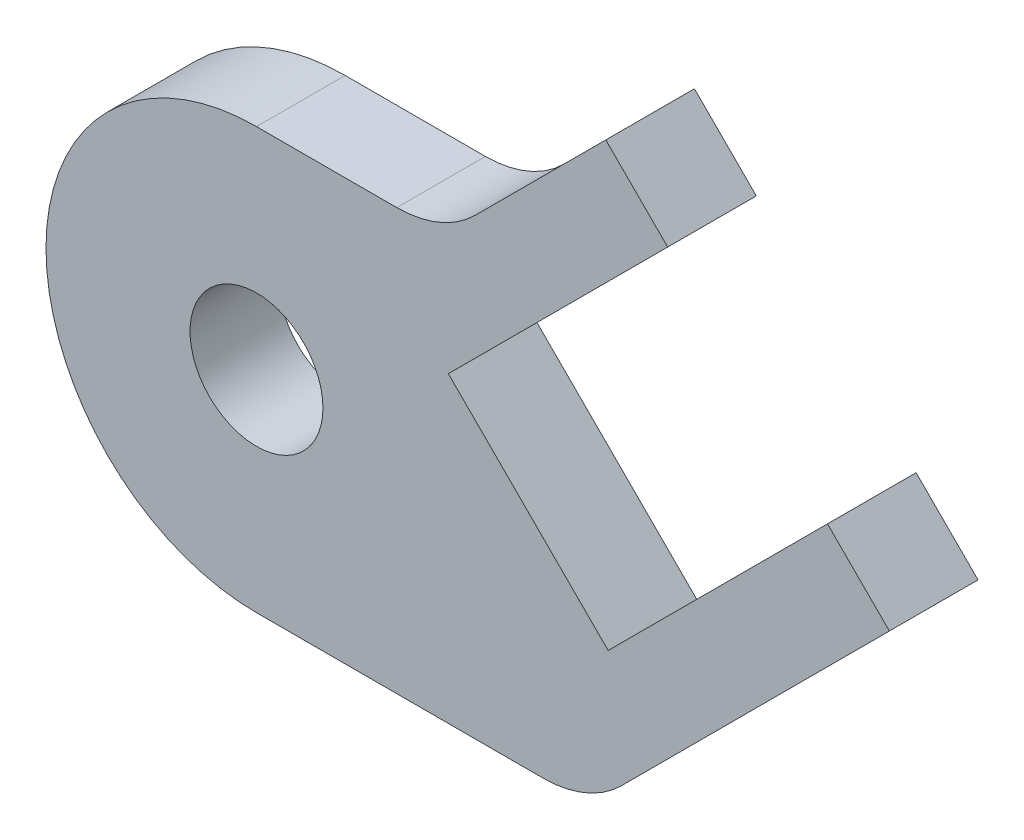
ISO-10303-21;
HEADER;
FILE_DESCRIPTION(('STEP AP214'),'2;1');
FILE_NAME('part.step','',(''),(''),'','','');
FILE_SCHEMA(('AUTOMOTIVE_DESIGN { 1 0 10303 214 1 1 1 1 }'));
ENDSEC;
DATA;
#1=APPLICATION_CONTEXT('core data for automotive mechanical design processes');
#2=APPLICATION_PROTOCOL_DEFINITION('international standard','automotive_design',2000,#1);
#3=PRODUCT_CONTEXT('',#1,'mechanical');
#4=PRODUCT('Part','Part','',(#3));
#5=PRODUCT_RELATED_PRODUCT_CATEGORY('part','',(#4));
#6=PRODUCT_DEFINITION_FORMATION('','',#4);
#7=PRODUCT_DEFINITION_CONTEXT('part definition',#1,'design');
#8=PRODUCT_DEFINITION('design','',#6,#7);
#9=PRODUCT_DEFINITION_SHAPE('','',#8);
#10=(LENGTH_UNIT() NAMED_UNIT(*) SI_UNIT(.MILLI.,.METRE.));
#11=(NAMED_UNIT(*) PLANE_ANGLE_UNIT() SI_UNIT($,.RADIAN.));
#12=(NAMED_UNIT(*) SI_UNIT($,.STERADIAN.) SOLID_ANGLE_UNIT());
#13=UNCERTAINTY_MEASURE_WITH_UNIT(LENGTH_MEASURE(1.E-05),#10,'distance_accuracy_value','');
#14=(GEOMETRIC_REPRESENTATION_CONTEXT(3) GLOBAL_UNCERTAINTY_ASSIGNED_CONTEXT((#13)) GLOBAL_UNIT_ASSIGNED_CONTEXT((#10,
#11,#12)) REPRESENTATION_CONTEXT('',''));
#15=CARTESIAN_POINT('',(0.,0.,0.));
#16=DIRECTION('',(0.,0.,1.));
#17=DIRECTION('',(1.,0.,0.));
#18=AXIS2_PLACEMENT_3D('',#15,#16,#17);
#19=CARTESIAN_POINT('',(0.,0.,8.));
#20=DIRECTION('',(0.,0.,1.));
#21=DIRECTION('',(1.,0.,0.));
#22=AXIS2_PLACEMENT_3D('',#19,#20,#21);
#23=PLANE('',#22);
#24=CARTESIAN_POINT('',(0.,0.,8.));
#25=DIRECTION('',(0.,0.,1.));
#26=DIRECTION('',(1.,0.,0.));
#27=AXIS2_PLACEMENT_3D('',#24,#25,#26);
#28=CIRCLE('',#27,6.);
#29=CARTESIAN_POINT('',(6.,0.,8.));
#30=VERTEX_POINT('',#29);
#31=EDGE_CURVE('E227',#30,#30,#28,.T.);
#32=ORIENTED_EDGE('',*,*,#31,.F.);
#33=EDGE_LOOP('',(#32));
#34=FACE_BOUND('',#33,.T.);
#35=DIRECTION('',(0.707106781186548,-0.707106781186547,0.));
#36=VECTOR('',#35,1.);
#37=CARTESIAN_POINT('',(57.1302994486587,8.13029944865925,8.));
#38=LINE('',#37,#36);
#39=CARTESIAN_POINT('',(31.533033969707,33.727564927611,8.));
#40=VERTEX_POINT('',#39);
#41=CARTESIAN_POINT('',(37.1191775410805,28.1414213562375,8.));
#42=VERTEX_POINT('',#41);
#43=EDGE_CURVE('E138',#40,#42,#38,.T.);
#44=ORIENTED_EDGE('',*,*,#43,.F.);
#45=DIRECTION('',(-0.707106781186543,-0.707106781186552,0.));
#46=VECTOR('',#45,1.);
#47=CARTESIAN_POINT('',(38.6041017815724,40.7986327394765,8.));
#48=LINE('',#47,#46);
#49=CARTESIAN_POINT('',(19.7344012302307,21.9289321881346,8.));
#50=VERTEX_POINT('',#49);
#51=EDGE_CURVE('E190',#40,#50,#48,.T.);
#52=ORIENTED_EDGE('',*,*,#51,.T.);
#53=CARTESIAN_POINT('',(12.6633334183652,29.,8.));
#54=DIRECTION('',(0.,0.,1.));
#55=DIRECTION('',(1.,0.,0.));
#56=AXIS2_PLACEMENT_3D('',#53,#54,#55);
#57=CIRCLE('',#56,10.);
#58=CARTESIAN_POINT('',(12.6633334183652,19.,8.));
#59=VERTEX_POINT('',#58);
#60=EDGE_CURVE('E41',#50,#59,#57,.F.);
#61=ORIENTED_EDGE('',*,*,#60,.T.);
#62=DIRECTION('',(-1.,0.,0.));
#63=VECTOR('',#62,1.);
#64=CARTESIAN_POINT('',(16.8054690420962,19.,8.));
#65=LINE('',#64,#63);
#66=CARTESIAN_POINT('',(0.,19.,8.));
#67=VERTEX_POINT('',#66);
#68=EDGE_CURVE('E187',#59,#67,#65,.T.);
#69=ORIENTED_EDGE('',*,*,#68,.T.);
#70=CARTESIAN_POINT('',(0.,0.,8.));
#71=DIRECTION('',(0.,0.,1.));
#72=DIRECTION('',(1.,0.,0.));
#73=AXIS2_PLACEMENT_3D('',#70,#71,#72);
#74=CIRCLE('',#73,19.);
#75=CARTESIAN_POINT('',(0.,-19.,8.));
#76=VERTEX_POINT('',#75);
#77=EDGE_CURVE('E198',#67,#76,#74,.T.);
#78=ORIENTED_EDGE('',*,*,#77,.T.);
#79=DIRECTION('',(1.,0.,0.));
#80=VECTOR('',#79,1.);
#81=CARTESIAN_POINT('',(0.,-19.,8.));
#82=LINE('',#81,#80);
#83=CARTESIAN_POINT('',(25.857864376269,-18.9999999999997,8.));
#84=VERTEX_POINT('',#83);
#85=EDGE_CURVE('E216',#76,#84,#82,.T.);
#86=ORIENTED_EDGE('',*,*,#85,.T.);
#87=CARTESIAN_POINT('',(25.8578643762689,-8.99999999999968,8.));
#88=DIRECTION('',(0.,0.,1.));
#89=DIRECTION('',(1.,0.,0.));
#90=AXIS2_PLACEMENT_3D('',#87,#88,#89);
#91=CIRCLE('',#90,10.);
#92=CARTESIAN_POINT('',(32.9289321881341,-16.0710678118654,8.));
#93=VERTEX_POINT('',#92);
#94=EDGE_CURVE('E179',#84,#93,#91,.T.);
#95=ORIENTED_EDGE('',*,*,#94,.T.);
#96=DIRECTION('',(0.707106781186574,0.707106781186521,0.));
#97=VECTOR('',#96,1.);
#98=CARTESIAN_POINT('',(29.9999999999996,-18.9999999999996,8.));
#99=LINE('',#98,#97);
#100=CARTESIAN_POINT('',(57.1302994486587,8.13029944865925,8.));
#101=VERTEX_POINT('',#100);
#102=EDGE_CURVE('E214',#93,#101,#99,.T.);
#103=ORIENTED_EDGE('',*,*,#102,.T.);
#104=CARTESIAN_POINT('',(51.5441558772861,13.7164430200319,8.));
#105=VERTEX_POINT('',#104);
#106=EDGE_CURVE('E122',#105,#101,#38,.T.);
#107=ORIENTED_EDGE('',*,*,#106,.F.);
#108=DIRECTION('',(-0.707106781186562,-0.707106781186533,0.));
#109=VECTOR('',#108,1.);
#110=CARTESIAN_POINT('',(31.745166004062,-6.08254685319135,8.));
#111=LINE('',#110,#109);
#112=CARTESIAN_POINT('',(31.745166004062,-6.08254685319135,8.));
#113=VERTEX_POINT('',#112);
#114=EDGE_CURVE('E212',#105,#113,#111,.T.);
#115=ORIENTED_EDGE('',*,*,#114,.T.);
#116=DIRECTION('',(-0.707106781186544,0.707106781186551,0.));
#117=VECTOR('',#116,1.);
#118=CARTESIAN_POINT('',(17.3201876678565,8.34243148301427,8.));
#119=LINE('',#118,#117);
#120=CARTESIAN_POINT('',(17.3201876678565,8.34243148301427,8.));
#121=VERTEX_POINT('',#120);
#122=EDGE_CURVE('E159',#113,#121,#119,.T.);
#123=ORIENTED_EDGE('',*,*,#122,.T.);
#124=DIRECTION('',(0.707106781186562,0.707106781186533,0.));
#125=VECTOR('',#124,1.);
#126=CARTESIAN_POINT('',(17.3201876678565,8.34243148301427,8.));
#127=LINE('',#126,#125);
#128=EDGE_CURVE('E154',#121,#42,#127,.T.);
#129=ORIENTED_EDGE('',*,*,#128,.T.);
#130=EDGE_LOOP('',(#44,#52,#61,#69,#78,#86,#95,#103,#107,#115,#123,#129));
#131=FACE_BOUND('',#130,.T.);
#132=ADVANCED_FACE('F33',(#34,#131),#23,.T.);
#133=CARTESIAN_POINT('',(0.,0.,0.));
#134=DIRECTION('',(0.,0.,1.));
#135=DIRECTION('',(1.,0.,0.));
#136=AXIS2_PLACEMENT_3D('',#133,#134,#135);
#137=PLANE('',#136);
#138=CARTESIAN_POINT('',(0.,0.,0.));
#139=DIRECTION('',(0.,0.,1.));
#140=DIRECTION('',(1.,0.,0.));
#141=AXIS2_PLACEMENT_3D('',#138,#139,#140);
#142=CIRCLE('',#141,6.);
#143=CARTESIAN_POINT('',(6.,0.,0.));
#144=VERTEX_POINT('',#143);
#145=EDGE_CURVE('E230',#144,#144,#142,.T.);
#146=ORIENTED_EDGE('',*,*,#145,.T.);
#147=EDGE_LOOP('',(#146));
#148=FACE_BOUND('',#147,.T.);
#149=DIRECTION('',(-0.707106781186543,-0.707106781186552,0.));
#150=VECTOR('',#149,1.);
#151=CARTESIAN_POINT('',(38.6041017815724,40.7986327394765,0.));
#152=LINE('',#151,#150);
#153=CARTESIAN_POINT('',(31.533033969707,33.727564927611,0.));
#154=VERTEX_POINT('',#153);
#155=CARTESIAN_POINT('',(19.7344012302307,21.9289321881346,0.));
#156=VERTEX_POINT('',#155);
#157=EDGE_CURVE('E201',#154,#156,#152,.T.);
#158=ORIENTED_EDGE('',*,*,#157,.F.);
#159=DIRECTION('',(0.707106781186548,-0.707106781186547,0.));
#160=VECTOR('',#159,1.);
#161=CARTESIAN_POINT('',(57.1302994486587,8.13029944865925,0.));
#162=LINE('',#161,#160);
#163=CARTESIAN_POINT('',(37.1191775410805,28.1414213562375,0.));
#164=VERTEX_POINT('',#163);
#165=EDGE_CURVE('E48',#154,#164,#162,.T.);
#166=ORIENTED_EDGE('',*,*,#165,.T.);
#167=DIRECTION('',(0.707106781186562,0.707106781186533,0.));
#168=VECTOR('',#167,1.);
#169=CARTESIAN_POINT('',(17.3201876678565,8.34243148301427,0.));
#170=LINE('',#169,#168);
#171=CARTESIAN_POINT('',(17.3201876678565,8.34243148301427,0.));
#172=VERTEX_POINT('',#171);
#173=EDGE_CURVE('E206',#172,#164,#170,.T.);
#174=ORIENTED_EDGE('',*,*,#173,.F.);
#175=DIRECTION('',(-0.707106781186544,0.707106781186551,0.));
#176=VECTOR('',#175,1.);
#177=CARTESIAN_POINT('',(17.3201876678565,8.34243148301427,0.));
#178=LINE('',#177,#176);
#179=CARTESIAN_POINT('',(31.745166004062,-6.08254685319135,0.));
#180=VERTEX_POINT('',#179);
#181=EDGE_CURVE('E146',#180,#172,#178,.T.);
#182=ORIENTED_EDGE('',*,*,#181,.F.);
#183=DIRECTION('',(-0.707106781186562,-0.707106781186533,0.));
#184=VECTOR('',#183,1.);
#185=CARTESIAN_POINT('',(31.745166004062,-6.08254685319135,0.));
#186=LINE('',#185,#184);
#187=CARTESIAN_POINT('',(51.5441558772861,13.7164430200319,0.));
#188=VERTEX_POINT('',#187);
#189=EDGE_CURVE('E137',#188,#180,#186,.T.);
#190=ORIENTED_EDGE('',*,*,#189,.F.);
#191=CARTESIAN_POINT('',(57.1302994486587,8.13029944865925,0.));
#192=VERTEX_POINT('',#191);
#193=EDGE_CURVE('E56',#188,#192,#162,.T.);
#194=ORIENTED_EDGE('',*,*,#193,.T.);
#195=DIRECTION('',(0.707106781186574,0.707106781186521,0.));
#196=VECTOR('',#195,1.);
#197=CARTESIAN_POINT('',(29.9999999999996,-18.9999999999996,0.));
#198=LINE('',#197,#196);
#199=CARTESIAN_POINT('',(32.9289321881341,-16.0710678118654,0.));
#200=VERTEX_POINT('',#199);
#201=EDGE_CURVE('E135',#200,#192,#198,.T.);
#202=ORIENTED_EDGE('',*,*,#201,.F.);
#203=CARTESIAN_POINT('',(25.8578643762689,-8.99999999999968,0.));
#204=DIRECTION('',(0.,0.,1.));
#205=DIRECTION('',(1.,0.,0.));
#206=AXIS2_PLACEMENT_3D('',#203,#204,#205);
#207=CIRCLE('',#206,10.);
#208=CARTESIAN_POINT('',(25.857864376269,-18.9999999999997,0.));
#209=VERTEX_POINT('',#208);
#210=EDGE_CURVE('E175',#200,#209,#207,.F.);
#211=ORIENTED_EDGE('',*,*,#210,.T.);
#212=DIRECTION('',(1.,0.,0.));
#213=VECTOR('',#212,1.);
#214=CARTESIAN_POINT('',(0.,-19.,0.));
#215=LINE('',#214,#213);
#216=CARTESIAN_POINT('',(0.,-19.,0.));
#217=VERTEX_POINT('',#216);
#218=EDGE_CURVE('E144',#217,#209,#215,.T.);
#219=ORIENTED_EDGE('',*,*,#218,.F.);
#220=CARTESIAN_POINT('',(0.,0.,0.));
#221=DIRECTION('',(0.,0.,1.));
#222=DIRECTION('',(1.,0.,0.));
#223=AXIS2_PLACEMENT_3D('',#220,#221,#222);
#224=CIRCLE('',#223,19.);
#225=CARTESIAN_POINT('',(0.,19.,0.));
#226=VERTEX_POINT('',#225);
#227=EDGE_CURVE('E149',#226,#217,#224,.T.);
#228=ORIENTED_EDGE('',*,*,#227,.F.);
#229=DIRECTION('',(-1.,0.,0.));
#230=VECTOR('',#229,1.);
#231=CARTESIAN_POINT('',(16.8054690420962,19.,0.));
#232=LINE('',#231,#230);
#233=CARTESIAN_POINT('',(12.6633334183652,19.,0.));
#234=VERTEX_POINT('',#233);
#235=EDGE_CURVE('E203',#234,#226,#232,.T.);
#236=ORIENTED_EDGE('',*,*,#235,.F.);
#237=CARTESIAN_POINT('',(12.6633334183652,29.,0.));
#238=DIRECTION('',(0.,0.,1.));
#239=DIRECTION('',(1.,0.,0.));
#240=AXIS2_PLACEMENT_3D('',#237,#238,#239);
#241=CIRCLE('',#240,10.);
#242=EDGE_CURVE('E181',#234,#156,#241,.T.);
#243=ORIENTED_EDGE('',*,*,#242,.T.);
#244=EDGE_LOOP('',(#158,#166,#174,#182,#190,#194,#202,#211,#219,#228,#236,#243));
#245=FACE_BOUND('',#244,.T.);
#246=ADVANCED_FACE('F134',(#148,#245),#137,.F.);
#247=CARTESIAN_POINT('',(17.3201876678565,8.34243148301427,8.));
#248=DIRECTION('',(-0.707106781186533,0.707106781186562,0.));
#249=DIRECTION('',(-0.707106781186562,-0.707106781186533,0.));
#250=AXIS2_PLACEMENT_3D('',#247,#248,#249);
#251=PLANE('',#250);
#252=ORIENTED_EDGE('',*,*,#173,.T.);
#253=DIRECTION('',(0.,0.,1.));
#254=VECTOR('',#253,1.);
#255=CARTESIAN_POINT('',(37.1191775410805,28.1414213562375,8.));
#256=LINE('',#255,#254);
#257=EDGE_CURVE('E127',#164,#42,#256,.T.);
#258=ORIENTED_EDGE('',*,*,#257,.T.);
#259=ORIENTED_EDGE('',*,*,#128,.F.);
#260=DIRECTION('',(0.,0.,-1.));
#261=VECTOR('',#260,1.);
#262=CARTESIAN_POINT('',(17.3201876678565,8.34243148301427,8.));
#263=LINE('',#262,#261);
#264=EDGE_CURVE('E155',#121,#172,#263,.T.);
#265=ORIENTED_EDGE('',*,*,#264,.T.);
#266=EDGE_LOOP('',(#252,#258,#259,#265));
#267=FACE_BOUND('',#266,.T.);
#268=ADVANCED_FACE('F247',(#267),#251,.F.);
#269=CARTESIAN_POINT('',(38.6041017815724,40.7986327394765,8.));
#270=DIRECTION('',(0.707106781186552,-0.707106781186543,0.));
#271=DIRECTION('',(0.707106781186543,0.707106781186552,0.));
#272=AXIS2_PLACEMENT_3D('',#269,#270,#271);
#273=PLANE('',#272);
#274=ORIENTED_EDGE('',*,*,#51,.F.);
#275=DIRECTION('',(0.,0.,1.));
#276=VECTOR('',#275,1.);
#277=CARTESIAN_POINT('',(31.533033969707,33.727564927611,0.));
#278=LINE('',#277,#276);
#279=EDGE_CURVE('E128',#154,#40,#278,.T.);
#280=ORIENTED_EDGE('',*,*,#279,.F.);
#281=ORIENTED_EDGE('',*,*,#157,.T.);
#282=DIRECTION('',(0.,0.,-1.));
#283=VECTOR('',#282,1.);
#284=CARTESIAN_POINT('',(19.7344012302307,21.9289321881346,8.));
#285=LINE('',#284,#283);
#286=EDGE_CURVE('E171',#156,#50,#285,.F.);
#287=ORIENTED_EDGE('',*,*,#286,.T.);
#288=EDGE_LOOP('',(#274,#280,#281,#287));
#289=FACE_BOUND('',#288,.T.);
#290=ADVANCED_FACE('F271',(#289),#273,.F.);
#291=CARTESIAN_POINT('',(16.8054690420962,19.,8.));
#292=DIRECTION('',(0.,-1.,0.));
#293=DIRECTION('',(0.,0.,-1.));
#294=AXIS2_PLACEMENT_3D('',#291,#292,#293);
#295=PLANE('',#294);
#296=ORIENTED_EDGE('',*,*,#68,.F.);
#297=DIRECTION('',(0.,0.,-1.));
#298=VECTOR('',#297,1.);
#299=CARTESIAN_POINT('',(12.6633334183652,19.,0.));
#300=LINE('',#299,#298);
#301=EDGE_CURVE('E168',#59,#234,#300,.T.);
#302=ORIENTED_EDGE('',*,*,#301,.T.);
#303=ORIENTED_EDGE('',*,*,#235,.T.);
#304=DIRECTION('',(0.,0.,-1.));
#305=VECTOR('',#304,1.);
#306=CARTESIAN_POINT('',(0.,19.,8.));
#307=LINE('',#306,#305);
#308=EDGE_CURVE('E165',#67,#226,#307,.T.);
#309=ORIENTED_EDGE('',*,*,#308,.F.);
#310=EDGE_LOOP('',(#296,#302,#303,#309));
#311=FACE_BOUND('',#310,.T.);
#312=ADVANCED_FACE('F195',(#311),#295,.F.);
#313=CARTESIAN_POINT('',(0.,0.,8.));
#314=DIRECTION('',(0.,0.,-1.));
#315=DIRECTION('',(-1.,0.,0.));
#316=AXIS2_PLACEMENT_3D('',#313,#314,#315);
#317=CYLINDRICAL_SURFACE('',#316,19.);
#318=ORIENTED_EDGE('',*,*,#227,.T.);
#319=DIRECTION('',(0.,0.,-1.));
#320=VECTOR('',#319,1.);
#321=CARTESIAN_POINT('',(0.,-19.,8.));
#322=LINE('',#321,#320);
#323=EDGE_CURVE('E162',#76,#217,#322,.T.);
#324=ORIENTED_EDGE('',*,*,#323,.F.);
#325=ORIENTED_EDGE('',*,*,#77,.F.);
#326=ORIENTED_EDGE('',*,*,#308,.T.);
#327=EDGE_LOOP('',(#318,#324,#325,#326));
#328=FACE_BOUND('',#327,.T.);
#329=ADVANCED_FACE('F264',(#328),#317,.T.);
#330=CARTESIAN_POINT('',(0.,-19.,8.));
#331=DIRECTION('',(0.,1.,0.));
#332=DIRECTION('',(-1.,0.,0.));
#333=AXIS2_PLACEMENT_3D('',#330,#331,#332);
#334=PLANE('',#333);
#335=ORIENTED_EDGE('',*,*,#218,.T.);
#336=DIRECTION('',(0.,0.,-1.));
#337=VECTOR('',#336,1.);
#338=CARTESIAN_POINT('',(25.857864376269,-18.9999999999997,8.));
#339=LINE('',#338,#337);
#340=EDGE_CURVE('E177',#209,#84,#339,.F.);
#341=ORIENTED_EDGE('',*,*,#340,.T.);
#342=ORIENTED_EDGE('',*,*,#85,.F.);
#343=ORIENTED_EDGE('',*,*,#323,.T.);
#344=EDGE_LOOP('',(#335,#341,#342,#343));
#345=FACE_BOUND('',#344,.T.);
#346=ADVANCED_FACE('F261',(#345),#334,.F.);
#347=CARTESIAN_POINT('',(29.9999999999996,-18.9999999999996,8.));
#348=DIRECTION('',(-0.707106781186521,0.707106781186574,0.));
#349=DIRECTION('',(-0.707106781186574,-0.707106781186521,0.));
#350=AXIS2_PLACEMENT_3D('',#347,#348,#349);
#351=PLANE('',#350);
#352=ORIENTED_EDGE('',*,*,#201,.T.);
#353=DIRECTION('',(0.,0.,1.));
#354=VECTOR('',#353,1.);
#355=CARTESIAN_POINT('',(57.1302994486587,8.13029944865925,0.));
#356=LINE('',#355,#354);
#357=EDGE_CURVE('E119',#192,#101,#356,.T.);
#358=ORIENTED_EDGE('',*,*,#357,.T.);
#359=ORIENTED_EDGE('',*,*,#102,.F.);
#360=DIRECTION('',(0.,0.,-1.));
#361=VECTOR('',#360,1.);
#362=CARTESIAN_POINT('',(32.9289321881341,-16.0710678118654,8.));
#363=LINE('',#362,#361);
#364=EDGE_CURVE('E143',#93,#200,#363,.T.);
#365=ORIENTED_EDGE('',*,*,#364,.T.);
#366=EDGE_LOOP('',(#352,#358,#359,#365));
#367=FACE_BOUND('',#366,.T.);
#368=ADVANCED_FACE('F141',(#367),#351,.F.);
#369=CARTESIAN_POINT('',(31.745166004062,-6.08254685319135,8.));
#370=DIRECTION('',(0.707106781186533,-0.707106781186563,0.));
#371=DIRECTION('',(0.707106781186562,0.707106781186533,0.));
#372=AXIS2_PLACEMENT_3D('',#369,#370,#371);
#373=PLANE('',#372);
#374=ORIENTED_EDGE('',*,*,#114,.F.);
#375=DIRECTION('',(0.,0.,-1.));
#376=VECTOR('',#375,1.);
#377=CARTESIAN_POINT('',(51.5441558772861,13.7164430200319,8.));
#378=LINE('',#377,#376);
#379=EDGE_CURVE('E11',#105,#188,#378,.T.);
#380=ORIENTED_EDGE('',*,*,#379,.T.);
#381=ORIENTED_EDGE('',*,*,#189,.T.);
#382=DIRECTION('',(0.,0.,-1.));
#383=VECTOR('',#382,1.);
#384=CARTESIAN_POINT('',(31.745166004062,-6.08254685319135,8.));
#385=LINE('',#384,#383);
#386=EDGE_CURVE('E158',#113,#180,#385,.T.);
#387=ORIENTED_EDGE('',*,*,#386,.F.);
#388=EDGE_LOOP('',(#374,#380,#381,#387));
#389=FACE_BOUND('',#388,.T.);
#390=ADVANCED_FACE('F254',(#389),#373,.F.);
#391=CARTESIAN_POINT('',(17.3201876678565,8.34243148301427,8.));
#392=DIRECTION('',(-0.707106781186551,-0.707106781186544,0.));
#393=DIRECTION('',(0.707106781186544,-0.707106781186551,0.));
#394=AXIS2_PLACEMENT_3D('',#391,#392,#393);
#395=PLANE('',#394);
#396=ORIENTED_EDGE('',*,*,#181,.T.);
#397=ORIENTED_EDGE('',*,*,#264,.F.);
#398=ORIENTED_EDGE('',*,*,#122,.F.);
#399=ORIENTED_EDGE('',*,*,#386,.T.);
#400=EDGE_LOOP('',(#396,#397,#398,#399));
#401=FACE_BOUND('',#400,.T.);
#402=ADVANCED_FACE('F251',(#401),#395,.F.);
#403=CARTESIAN_POINT('',(12.6633334183652,29.,8.));
#404=DIRECTION('',(0.,0.,1.));
#405=DIRECTION('',(1.,0.,0.));
#406=AXIS2_PLACEMENT_3D('',#403,#404,#405);
#407=CYLINDRICAL_SURFACE('',#406,10.);
#408=ORIENTED_EDGE('',*,*,#60,.F.);
#409=ORIENTED_EDGE('',*,*,#286,.F.);
#410=ORIENTED_EDGE('',*,*,#242,.F.);
#411=ORIENTED_EDGE('',*,*,#301,.F.);
#412=EDGE_LOOP('',(#408,#409,#410,#411));
#413=FACE_BOUND('',#412,.T.);
#414=ADVANCED_FACE('F200',(#413),#407,.F.);
#415=CARTESIAN_POINT('',(25.8578643762689,-8.99999999999968,8.));
#416=DIRECTION('',(0.,0.,-1.));
#417=DIRECTION('',(-1.,0.,0.));
#418=AXIS2_PLACEMENT_3D('',#415,#416,#417);
#419=CYLINDRICAL_SURFACE('',#418,10.);
#420=ORIENTED_EDGE('',*,*,#94,.F.);
#421=ORIENTED_EDGE('',*,*,#340,.F.);
#422=ORIENTED_EDGE('',*,*,#210,.F.);
#423=ORIENTED_EDGE('',*,*,#364,.F.);
#424=EDGE_LOOP('',(#420,#421,#422,#423));
#425=FACE_BOUND('',#424,.T.);
#426=ADVANCED_FACE('F35',(#425),#419,.T.);
#427=CARTESIAN_POINT('',(57.1302994486587,8.13029944865925,0.));
#428=DIRECTION('',(-0.707106781186547,-0.707106781186548,0.));
#429=DIRECTION('',(0.707106781186548,-0.707106781186547,0.));
#430=AXIS2_PLACEMENT_3D('',#427,#428,#429);
#431=PLANE('',#430);
#432=ORIENTED_EDGE('',*,*,#106,.T.);
#433=ORIENTED_EDGE('',*,*,#357,.F.);
#434=ORIENTED_EDGE('',*,*,#193,.F.);
#435=ORIENTED_EDGE('',*,*,#379,.F.);
#436=EDGE_LOOP('',(#432,#433,#434,#435));
#437=FACE_BOUND('',#436,.T.);
#438=ADVANCED_FACE('F120',(#437),#431,.F.);
#439=ORIENTED_EDGE('',*,*,#165,.F.);
#440=ORIENTED_EDGE('',*,*,#279,.T.);
#441=ORIENTED_EDGE('',*,*,#43,.T.);
#442=ORIENTED_EDGE('',*,*,#257,.F.);
#443=EDGE_LOOP('',(#439,#440,#441,#442));
#444=FACE_BOUND('',#443,.T.);
#445=ADVANCED_FACE('F238',(#444),#431,.F.);
#446=CARTESIAN_POINT('',(0.,0.,0.));
#447=DIRECTION('',(0.,0.,1.));
#448=DIRECTION('',(1.,0.,0.));
#449=AXIS2_PLACEMENT_3D('',#446,#447,#448);
#450=CYLINDRICAL_SURFACE('',#449,6.);
#451=ORIENTED_EDGE('',*,*,#145,.F.);
#452=EDGE_LOOP('',(#451));
#453=FACE_BOUND('',#452,.T.);
#454=ORIENTED_EDGE('',*,*,#31,.T.);
#455=EDGE_LOOP('',(#454));
#456=FACE_BOUND('',#455,.T.);
#457=ADVANCED_FACE('F235',(#453,#456),#450,.F.);
#458=CLOSED_SHELL('',(#132,#246,#268,#290,#312,#329,#346,#368,#390,#402,#414,#426,#438,#445,#457));
#459=MANIFOLD_SOLID_BREP('B2',#458);
#460=ADVANCED_BREP_SHAPE_REPRESENTATION('',(#18,#459),#14);
#461=SHAPE_DEFINITION_REPRESENTATION(#9,#460);
ENDSEC;
END-ISO-10303-21;
